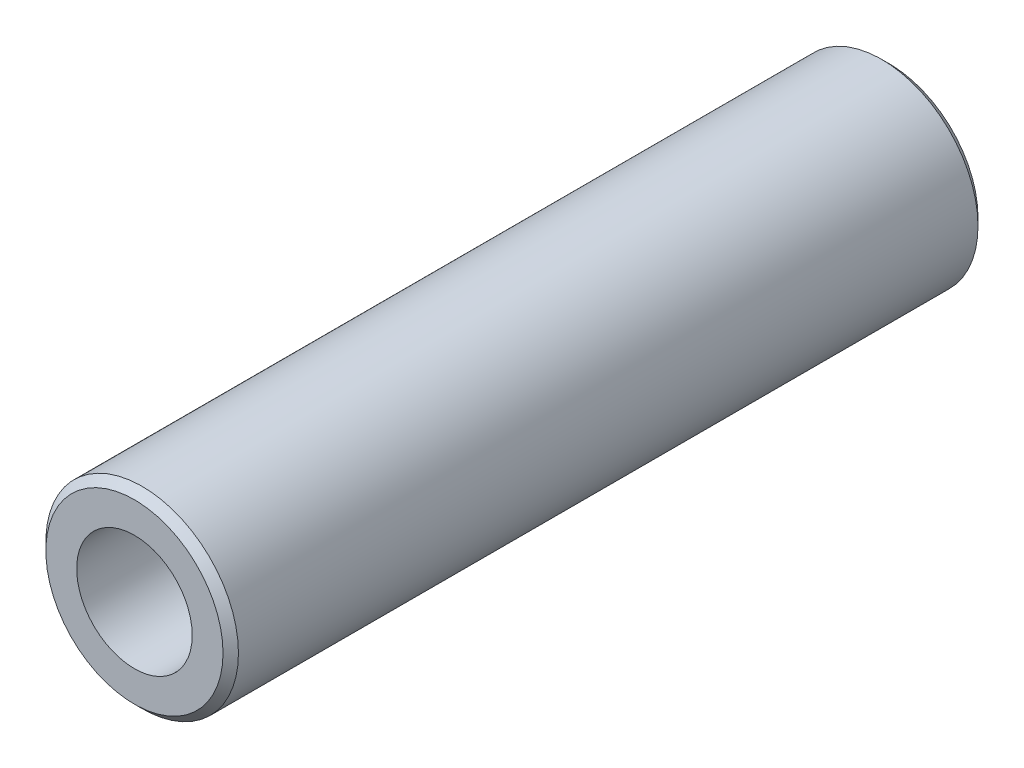
ISO-10303-21;
HEADER;
FILE_DESCRIPTION(('STEP AP214'),'2;1');
FILE_NAME('part.step','',(''),(''),'','','');
FILE_SCHEMA(('AUTOMOTIVE_DESIGN { 1 0 10303 214 1 1 1 1 }'));
ENDSEC;
DATA;
#1=APPLICATION_CONTEXT('core data for automotive mechanical design processes');
#2=APPLICATION_PROTOCOL_DEFINITION('international standard','automotive_design',2000,#1);
#3=PRODUCT_CONTEXT('',#1,'mechanical');
#4=PRODUCT('Part','Part','',(#3));
#5=PRODUCT_RELATED_PRODUCT_CATEGORY('part','',(#4));
#6=PRODUCT_DEFINITION_FORMATION('','',#4);
#7=PRODUCT_DEFINITION_CONTEXT('part definition',#1,'design');
#8=PRODUCT_DEFINITION('design','',#6,#7);
#9=PRODUCT_DEFINITION_SHAPE('','',#8);
#10=(LENGTH_UNIT() NAMED_UNIT(*) SI_UNIT(.MILLI.,.METRE.));
#11=(NAMED_UNIT(*) PLANE_ANGLE_UNIT() SI_UNIT($,.RADIAN.));
#12=(NAMED_UNIT(*) SI_UNIT($,.STERADIAN.) SOLID_ANGLE_UNIT());
#13=UNCERTAINTY_MEASURE_WITH_UNIT(LENGTH_MEASURE(1.E-05),#10,'distance_accuracy_value','');
#14=(GEOMETRIC_REPRESENTATION_CONTEXT(3) GLOBAL_UNCERTAINTY_ASSIGNED_CONTEXT((#13)) GLOBAL_UNIT_ASSIGNED_CONTEXT((#10,
#11,#12)) REPRESENTATION_CONTEXT('',''));
#15=CARTESIAN_POINT('',(0.,0.,0.));
#16=DIRECTION('',(0.,0.,1.));
#17=DIRECTION('',(1.,0.,0.));
#18=AXIS2_PLACEMENT_3D('',#15,#16,#17);
#19=CARTESIAN_POINT('',(0.,0.,24.5));
#20=DIRECTION('',(0.,0.,1.));
#21=DIRECTION('',(1.,0.,0.));
#22=AXIS2_PLACEMENT_3D('',#19,#20,#21);
#23=PLANE('',#22);
#24=CARTESIAN_POINT('',(0.,0.,24.5));
#25=DIRECTION('',(0.,0.,1.));
#26=DIRECTION('',(1.,0.,0.));
#27=AXIS2_PLACEMENT_3D('',#24,#25,#26);
#28=CIRCLE('',#27,5.75);
#29=CARTESIAN_POINT('',(5.75,0.,24.5));
#30=VERTEX_POINT('',#29);
#31=EDGE_CURVE('E11',#30,#30,#28,.T.);
#32=ORIENTED_EDGE('',*,*,#31,.T.);
#33=EDGE_LOOP('',(#32));
#34=FACE_BOUND('',#33,.T.);
#35=CARTESIAN_POINT('',(0.,0.,24.5));
#36=DIRECTION('',(0.,0.,1.));
#37=DIRECTION('',(1.,0.,0.));
#38=AXIS2_PLACEMENT_3D('',#35,#36,#37);
#39=CIRCLE('',#38,3.75);
#40=CARTESIAN_POINT('',(3.75,0.,24.5));
#41=VERTEX_POINT('',#40);
#42=EDGE_CURVE('E66',#41,#41,#39,.T.);
#43=ORIENTED_EDGE('',*,*,#42,.F.);
#44=EDGE_LOOP('',(#43));
#45=FACE_BOUND('',#44,.T.);
#46=ADVANCED_FACE('F45',(#34,#45),#23,.T.);
#47=CARTESIAN_POINT('',(0.,0.,-24.5));
#48=DIRECTION('',(0.,0.,1.));
#49=DIRECTION('',(1.,0.,0.));
#50=AXIS2_PLACEMENT_3D('',#47,#48,#49);
#51=PLANE('',#50);
#52=CARTESIAN_POINT('',(0.,0.,-24.5));
#53=DIRECTION('',(0.,0.,1.));
#54=DIRECTION('',(1.,0.,0.));
#55=AXIS2_PLACEMENT_3D('',#52,#53,#54);
#56=CIRCLE('',#55,5.74999999999998);
#57=CARTESIAN_POINT('',(5.74999999999998,0.,-24.5));
#58=VERTEX_POINT('',#57);
#59=EDGE_CURVE('E53',#58,#58,#56,.F.);
#60=ORIENTED_EDGE('',*,*,#59,.T.);
#61=EDGE_LOOP('',(#60));
#62=FACE_BOUND('',#61,.T.);
#63=CARTESIAN_POINT('',(0.,0.,-24.5));
#64=DIRECTION('',(0.,0.,1.));
#65=DIRECTION('',(1.,0.,0.));
#66=AXIS2_PLACEMENT_3D('',#63,#64,#65);
#67=CIRCLE('',#66,3.75);
#68=CARTESIAN_POINT('',(3.75,0.,-24.5));
#69=VERTEX_POINT('',#68);
#70=EDGE_CURVE('E67',#69,#69,#67,.T.);
#71=ORIENTED_EDGE('',*,*,#70,.T.);
#72=EDGE_LOOP('',(#71));
#73=FACE_BOUND('',#72,.T.);
#74=ADVANCED_FACE('F77',(#62,#73),#51,.F.);
#75=CARTESIAN_POINT('',(0.,0.,24.5));
#76=DIRECTION('',(0.,0.,-1.));
#77=DIRECTION('',(-1.,0.,0.));
#78=AXIS2_PLACEMENT_3D('',#75,#76,#77);
#79=CYLINDRICAL_SURFACE('',#78,6.25);
#80=CARTESIAN_POINT('',(0.,0.,-24.));
#81=DIRECTION('',(0.,0.,1.));
#82=DIRECTION('',(1.,0.,0.));
#83=AXIS2_PLACEMENT_3D('',#80,#81,#82);
#84=CIRCLE('',#83,6.25);
#85=CARTESIAN_POINT('',(6.25,0.,-24.));
#86=VERTEX_POINT('',#85);
#87=EDGE_CURVE('E57',#86,#86,#84,.T.);
#88=ORIENTED_EDGE('',*,*,#87,.T.);
#89=EDGE_LOOP('',(#88));
#90=FACE_BOUND('',#89,.T.);
#91=CARTESIAN_POINT('',(0.,0.,24.));
#92=DIRECTION('',(0.,0.,1.));
#93=DIRECTION('',(1.,0.,0.));
#94=AXIS2_PLACEMENT_3D('',#91,#92,#93);
#95=CIRCLE('',#94,6.25);
#96=CARTESIAN_POINT('',(6.25,0.,24.));
#97=VERTEX_POINT('',#96);
#98=EDGE_CURVE('E61',#97,#97,#95,.F.);
#99=ORIENTED_EDGE('',*,*,#98,.T.);
#100=EDGE_LOOP('',(#99));
#101=FACE_BOUND('',#100,.T.);
#102=ADVANCED_FACE('F83',(#90,#101),#79,.T.);
#103=CARTESIAN_POINT('',(0.,0.,24.5));
#104=DIRECTION('',(0.,0.,-1.));
#105=DIRECTION('',(-1.,0.,0.));
#106=AXIS2_PLACEMENT_3D('',#103,#104,#105);
#107=CYLINDRICAL_SURFACE('',#106,3.75);
#108=ORIENTED_EDGE('',*,*,#42,.T.);
#109=EDGE_LOOP('',(#108));
#110=FACE_BOUND('',#109,.T.);
#111=ORIENTED_EDGE('',*,*,#70,.F.);
#112=EDGE_LOOP('',(#111));
#113=FACE_BOUND('',#112,.T.);
#114=ADVANCED_FACE('F73',(#110,#113),#107,.F.);
#115=CARTESIAN_POINT('',(0.,0.,-24.));
#116=DIRECTION('',(0.,0.,1.));
#117=DIRECTION('',(1.,0.,0.));
#118=AXIS2_PLACEMENT_3D('',#115,#116,#117);
#119=CONICAL_SURFACE('',#118,6.25,0.785398163397454);
#120=ORIENTED_EDGE('',*,*,#59,.F.);
#121=EDGE_LOOP('',(#120));
#122=FACE_BOUND('',#121,.T.);
#123=ORIENTED_EDGE('',*,*,#87,.F.);
#124=EDGE_LOOP('',(#123));
#125=FACE_BOUND('',#124,.T.);
#126=ADVANCED_FACE('F90',(#122,#125),#119,.T.);
#127=CARTESIAN_POINT('',(0.,0.,24.5));
#128=DIRECTION('',(0.,0.,-1.));
#129=DIRECTION('',(-1.,0.,0.));
#130=AXIS2_PLACEMENT_3D('',#127,#128,#129);
#131=CONICAL_SURFACE('',#130,5.75,0.785398163397447);
#132=ORIENTED_EDGE('',*,*,#98,.F.);
#133=EDGE_LOOP('',(#132));
#134=FACE_BOUND('',#133,.T.);
#135=ORIENTED_EDGE('',*,*,#31,.F.);
#136=EDGE_LOOP('',(#135));
#137=FACE_BOUND('',#136,.T.);
#138=ADVANCED_FACE('F48',(#134,#137),#131,.T.);
#139=CLOSED_SHELL('',(#46,#74,#102,#114,#126,#138));
#140=MANIFOLD_SOLID_BREP('B2',#139);
#141=ADVANCED_BREP_SHAPE_REPRESENTATION('',(#18,#140),#14);
#142=SHAPE_DEFINITION_REPRESENTATION(#9,#141);
ENDSEC;
END-ISO-10303-21;
